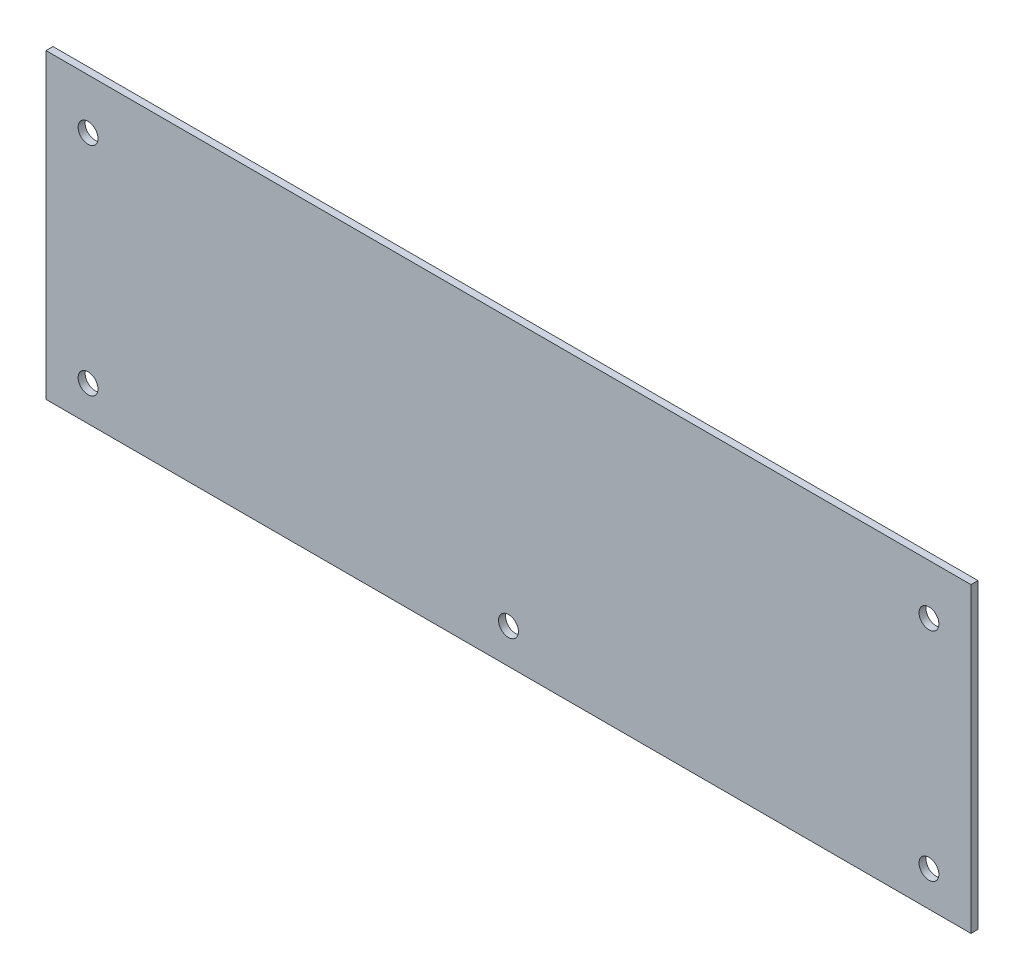
ISO-10303-21;
HEADER;
FILE_DESCRIPTION(('STEP AP214'),'2;1');
FILE_NAME('part.step','',(''),(''),'','','');
FILE_SCHEMA(('AUTOMOTIVE_DESIGN { 1 0 10303 214 1 1 1 1 }'));
ENDSEC;
DATA;
#1=APPLICATION_CONTEXT('core data for automotive mechanical design processes');
#2=APPLICATION_PROTOCOL_DEFINITION('international standard','automotive_design',2000,#1);
#3=PRODUCT_CONTEXT('',#1,'mechanical');
#4=PRODUCT('Part','Part','',(#3));
#5=PRODUCT_RELATED_PRODUCT_CATEGORY('part','',(#4));
#6=PRODUCT_DEFINITION_FORMATION('','',#4);
#7=PRODUCT_DEFINITION_CONTEXT('part definition',#1,'design');
#8=PRODUCT_DEFINITION('design','',#6,#7);
#9=PRODUCT_DEFINITION_SHAPE('','',#8);
#10=(LENGTH_UNIT() NAMED_UNIT(*) SI_UNIT(.MILLI.,.METRE.));
#11=(NAMED_UNIT(*) PLANE_ANGLE_UNIT() SI_UNIT($,.RADIAN.));
#12=(NAMED_UNIT(*) SI_UNIT($,.STERADIAN.) SOLID_ANGLE_UNIT());
#13=UNCERTAINTY_MEASURE_WITH_UNIT(LENGTH_MEASURE(1.E-05),#10,'distance_accuracy_value','');
#14=(GEOMETRIC_REPRESENTATION_CONTEXT(3) GLOBAL_UNCERTAINTY_ASSIGNED_CONTEXT((#13)) GLOBAL_UNIT_ASSIGNED_CONTEXT((#10,
#11,#12)) REPRESENTATION_CONTEXT('',''));
#15=CARTESIAN_POINT('',(0.,0.,0.));
#16=DIRECTION('',(0.,0.,1.));
#17=DIRECTION('',(1.,0.,0.));
#18=AXIS2_PLACEMENT_3D('',#15,#16,#17);
#19=CARTESIAN_POINT('',(0.,0.,3.));
#20=DIRECTION('',(0.,0.,-1.));
#21=DIRECTION('',(-1.,0.,0.));
#22=AXIS2_PLACEMENT_3D('',#19,#20,#21);
#23=PLANE('',#22);
#24=CARTESIAN_POINT('',(381.35,107.84,3.));
#25=DIRECTION('',(0.,0.,1.));
#26=DIRECTION('',(1.,0.,0.));
#27=AXIS2_PLACEMENT_3D('',#24,#25,#26);
#28=CIRCLE('',#27,4.25000000000001);
#29=CARTESIAN_POINT('',(385.6,107.84,3.));
#30=VERTEX_POINT('',#29);
#31=EDGE_CURVE('E130',#30,#30,#28,.T.);
#32=ORIENTED_EDGE('',*,*,#31,.F.);
#33=EDGE_LOOP('',(#32));
#34=FACE_BOUND('',#33,.T.);
#35=CARTESIAN_POINT('',(381.35,15.,3.));
#36=DIRECTION('',(0.,0.,1.));
#37=DIRECTION('',(1.,0.,0.));
#38=AXIS2_PLACEMENT_3D('',#35,#36,#37);
#39=CIRCLE('',#38,4.25000000000001);
#40=CARTESIAN_POINT('',(385.6,15.,3.));
#41=VERTEX_POINT('',#40);
#42=EDGE_CURVE('E138',#41,#41,#39,.T.);
#43=ORIENTED_EDGE('',*,*,#42,.F.);
#44=EDGE_LOOP('',(#43));
#45=FACE_BOUND('',#44,.T.);
#46=CARTESIAN_POINT('',(201.35,15.,3.));
#47=DIRECTION('',(0.,0.,1.));
#48=DIRECTION('',(1.,0.,0.));
#49=AXIS2_PLACEMENT_3D('',#46,#47,#48);
#50=CIRCLE('',#49,4.25);
#51=CARTESIAN_POINT('',(205.6,15.,3.));
#52=VERTEX_POINT('',#51);
#53=EDGE_CURVE('E146',#52,#52,#50,.T.);
#54=ORIENTED_EDGE('',*,*,#53,.F.);
#55=EDGE_LOOP('',(#54));
#56=FACE_BOUND('',#55,.T.);
#57=CARTESIAN_POINT('',(21.35,15.,3.));
#58=DIRECTION('',(0.,0.,1.));
#59=DIRECTION('',(1.,0.,0.));
#60=AXIS2_PLACEMENT_3D('',#57,#58,#59);
#61=CIRCLE('',#60,4.25);
#62=CARTESIAN_POINT('',(25.6,15.,3.));
#63=VERTEX_POINT('',#62);
#64=EDGE_CURVE('E154',#63,#63,#61,.T.);
#65=ORIENTED_EDGE('',*,*,#64,.F.);
#66=EDGE_LOOP('',(#65));
#67=FACE_BOUND('',#66,.T.);
#68=CARTESIAN_POINT('',(21.35,107.84,3.));
#69=DIRECTION('',(0.,0.,1.));
#70=DIRECTION('',(1.,0.,0.));
#71=AXIS2_PLACEMENT_3D('',#68,#69,#70);
#72=CIRCLE('',#71,4.25);
#73=CARTESIAN_POINT('',(25.6,107.84,3.));
#74=VERTEX_POINT('',#73);
#75=EDGE_CURVE('E122',#74,#74,#72,.T.);
#76=ORIENTED_EDGE('',*,*,#75,.F.);
#77=EDGE_LOOP('',(#76));
#78=FACE_BOUND('',#77,.T.);
#79=DIRECTION('',(-1.,0.,0.));
#80=VECTOR('',#79,1.);
#81=CARTESIAN_POINT('',(29.,129.34,3.));
#82=LINE('',#81,#80);
#83=CARTESIAN_POINT('',(399.35,129.34,3.));
#84=VERTEX_POINT('',#83);
#85=CARTESIAN_POINT('',(3.35000000000002,129.34,3.));
#86=VERTEX_POINT('',#85);
#87=EDGE_CURVE('E11',#84,#86,#82,.T.);
#88=ORIENTED_EDGE('',*,*,#87,.T.);
#89=DIRECTION('',(0.,1.,0.));
#90=VECTOR('',#89,1.);
#91=CARTESIAN_POINT('',(3.34999999999999,0.,3.));
#92=LINE('',#91,#90);
#93=CARTESIAN_POINT('',(3.34999999999999,0.,3.));
#94=VERTEX_POINT('',#93);
#95=EDGE_CURVE('E57',#94,#86,#92,.T.);
#96=ORIENTED_EDGE('',*,*,#95,.F.);
#97=DIRECTION('',(1.,0.,0.));
#98=VECTOR('',#97,1.);
#99=CARTESIAN_POINT('',(0.,0.,3.));
#100=LINE('',#99,#98);
#101=CARTESIAN_POINT('',(399.35,0.,3.));
#102=VERTEX_POINT('',#101);
#103=EDGE_CURVE('E49',#94,#102,#100,.T.);
#104=ORIENTED_EDGE('',*,*,#103,.T.);
#105=DIRECTION('',(0.,-1.,0.));
#106=VECTOR('',#105,1.);
#107=CARTESIAN_POINT('',(399.35,0.,3.));
#108=LINE('',#107,#106);
#109=EDGE_CURVE('E114',#84,#102,#108,.T.);
#110=ORIENTED_EDGE('',*,*,#109,.F.);
#111=EDGE_LOOP('',(#88,#96,#104,#110));
#112=FACE_BOUND('',#111,.T.);
#113=ADVANCED_FACE('F39',(#34,#45,#56,#67,#78,#112),#23,.F.);
#114=CARTESIAN_POINT('',(0.,0.,0.));
#115=DIRECTION('',(0.,0.,-1.));
#116=DIRECTION('',(-1.,0.,0.));
#117=AXIS2_PLACEMENT_3D('',#114,#115,#116);
#118=PLANE('',#117);
#119=CARTESIAN_POINT('',(381.35,107.84,0.));
#120=DIRECTION('',(0.,0.,1.));
#121=DIRECTION('',(1.,0.,0.));
#122=AXIS2_PLACEMENT_3D('',#119,#120,#121);
#123=CIRCLE('',#122,4.25000000000001);
#124=CARTESIAN_POINT('',(385.6,107.84,0.));
#125=VERTEX_POINT('',#124);
#126=EDGE_CURVE('E134',#125,#125,#123,.T.);
#127=ORIENTED_EDGE('',*,*,#126,.T.);
#128=EDGE_LOOP('',(#127));
#129=FACE_BOUND('',#128,.T.);
#130=CARTESIAN_POINT('',(381.35,15.,0.));
#131=DIRECTION('',(0.,0.,1.));
#132=DIRECTION('',(1.,0.,0.));
#133=AXIS2_PLACEMENT_3D('',#130,#131,#132);
#134=CIRCLE('',#133,4.25000000000001);
#135=CARTESIAN_POINT('',(385.6,15.,0.));
#136=VERTEX_POINT('',#135);
#137=EDGE_CURVE('E142',#136,#136,#134,.T.);
#138=ORIENTED_EDGE('',*,*,#137,.T.);
#139=EDGE_LOOP('',(#138));
#140=FACE_BOUND('',#139,.T.);
#141=CARTESIAN_POINT('',(201.35,15.,0.));
#142=DIRECTION('',(0.,0.,1.));
#143=DIRECTION('',(1.,0.,0.));
#144=AXIS2_PLACEMENT_3D('',#141,#142,#143);
#145=CIRCLE('',#144,4.25);
#146=CARTESIAN_POINT('',(205.6,15.,0.));
#147=VERTEX_POINT('',#146);
#148=EDGE_CURVE('E150',#147,#147,#145,.T.);
#149=ORIENTED_EDGE('',*,*,#148,.T.);
#150=EDGE_LOOP('',(#149));
#151=FACE_BOUND('',#150,.T.);
#152=CARTESIAN_POINT('',(21.35,15.,0.));
#153=DIRECTION('',(0.,0.,1.));
#154=DIRECTION('',(1.,0.,0.));
#155=AXIS2_PLACEMENT_3D('',#152,#153,#154);
#156=CIRCLE('',#155,4.25);
#157=CARTESIAN_POINT('',(25.6,15.,0.));
#158=VERTEX_POINT('',#157);
#159=EDGE_CURVE('E126',#158,#158,#156,.T.);
#160=ORIENTED_EDGE('',*,*,#159,.T.);
#161=EDGE_LOOP('',(#160));
#162=FACE_BOUND('',#161,.T.);
#163=CARTESIAN_POINT('',(21.35,107.84,0.));
#164=DIRECTION('',(0.,0.,1.));
#165=DIRECTION('',(1.,0.,0.));
#166=AXIS2_PLACEMENT_3D('',#163,#164,#165);
#167=CIRCLE('',#166,4.25);
#168=CARTESIAN_POINT('',(25.6,107.84,0.));
#169=VERTEX_POINT('',#168);
#170=EDGE_CURVE('E117',#169,#169,#167,.T.);
#171=ORIENTED_EDGE('',*,*,#170,.T.);
#172=EDGE_LOOP('',(#171));
#173=FACE_BOUND('',#172,.T.);
#174=DIRECTION('',(0.,1.,0.));
#175=VECTOR('',#174,1.);
#176=CARTESIAN_POINT('',(3.34999999999999,0.,0.));
#177=LINE('',#176,#175);
#178=CARTESIAN_POINT('',(3.34999999999999,0.,0.));
#179=VERTEX_POINT('',#178);
#180=CARTESIAN_POINT('',(3.35000000000002,129.34,0.));
#181=VERTEX_POINT('',#180);
#182=EDGE_CURVE('E81',#179,#181,#177,.T.);
#183=ORIENTED_EDGE('',*,*,#182,.T.);
#184=DIRECTION('',(-1.,0.,0.));
#185=VECTOR('',#184,1.);
#186=CARTESIAN_POINT('',(29.,129.34,0.));
#187=LINE('',#186,#185);
#188=CARTESIAN_POINT('',(399.35,129.34,0.));
#189=VERTEX_POINT('',#188);
#190=EDGE_CURVE('E43',#189,#181,#187,.T.);
#191=ORIENTED_EDGE('',*,*,#190,.F.);
#192=DIRECTION('',(0.,-1.,0.));
#193=VECTOR('',#192,1.);
#194=CARTESIAN_POINT('',(399.35,0.,0.));
#195=LINE('',#194,#193);
#196=CARTESIAN_POINT('',(399.35,0.,0.));
#197=VERTEX_POINT('',#196);
#198=EDGE_CURVE('E65',#189,#197,#195,.T.);
#199=ORIENTED_EDGE('',*,*,#198,.T.);
#200=DIRECTION('',(1.,0.,0.));
#201=VECTOR('',#200,1.);
#202=CARTESIAN_POINT('',(0.,0.,0.));
#203=LINE('',#202,#201);
#204=EDGE_CURVE('E96',#179,#197,#203,.T.);
#205=ORIENTED_EDGE('',*,*,#204,.F.);
#206=EDGE_LOOP('',(#183,#191,#199,#205));
#207=FACE_BOUND('',#206,.T.);
#208=ADVANCED_FACE('F100',(#129,#140,#151,#162,#173,#207),#118,.T.);
#209=CARTESIAN_POINT('',(0.,0.,3.));
#210=DIRECTION('',(0.,1.,0.));
#211=DIRECTION('',(0.,0.,1.));
#212=AXIS2_PLACEMENT_3D('',#209,#210,#211);
#213=PLANE('',#212);
#214=ORIENTED_EDGE('',*,*,#103,.F.);
#215=DIRECTION('',(0.,0.,1.));
#216=VECTOR('',#215,1.);
#217=CARTESIAN_POINT('',(3.34999999999999,0.,0.));
#218=LINE('',#217,#216);
#219=EDGE_CURVE('E84',#179,#94,#218,.T.);
#220=ORIENTED_EDGE('',*,*,#219,.F.);
#221=ORIENTED_EDGE('',*,*,#204,.T.);
#222=DIRECTION('',(0.,0.,1.));
#223=VECTOR('',#222,1.);
#224=CARTESIAN_POINT('',(399.35,0.,0.));
#225=LINE('',#224,#223);
#226=EDGE_CURVE('E111',#197,#102,#225,.T.);
#227=ORIENTED_EDGE('',*,*,#226,.T.);
#228=EDGE_LOOP('',(#214,#220,#221,#227));
#229=FACE_BOUND('',#228,.T.);
#230=ADVANCED_FACE('F41',(#229),#213,.F.);
#231=CARTESIAN_POINT('',(29.,129.34,3.));
#232=DIRECTION('',(0.,-1.,0.));
#233=DIRECTION('',(0.,0.,-1.));
#234=AXIS2_PLACEMENT_3D('',#231,#232,#233);
#235=PLANE('',#234);
#236=ORIENTED_EDGE('',*,*,#190,.T.);
#237=DIRECTION('',(0.,0.,1.));
#238=VECTOR('',#237,1.);
#239=CARTESIAN_POINT('',(3.35000000000002,129.34,0.));
#240=LINE('',#239,#238);
#241=EDGE_CURVE('E85',#181,#86,#240,.T.);
#242=ORIENTED_EDGE('',*,*,#241,.T.);
#243=ORIENTED_EDGE('',*,*,#87,.F.);
#244=DIRECTION('',(0.,0.,1.));
#245=VECTOR('',#244,1.);
#246=CARTESIAN_POINT('',(399.35,129.34,0.));
#247=LINE('',#246,#245);
#248=EDGE_CURVE('E108',#189,#84,#247,.T.);
#249=ORIENTED_EDGE('',*,*,#248,.F.);
#250=EDGE_LOOP('',(#236,#242,#243,#249));
#251=FACE_BOUND('',#250,.T.);
#252=ADVANCED_FACE('F181',(#251),#235,.F.);
#253=CARTESIAN_POINT('',(399.35,0.,0.));
#254=DIRECTION('',(-1.,0.,0.));
#255=DIRECTION('',(0.,0.,1.));
#256=AXIS2_PLACEMENT_3D('',#253,#254,#255);
#257=PLANE('',#256);
#258=ORIENTED_EDGE('',*,*,#109,.T.);
#259=ORIENTED_EDGE('',*,*,#226,.F.);
#260=ORIENTED_EDGE('',*,*,#198,.F.);
#261=ORIENTED_EDGE('',*,*,#248,.T.);
#262=EDGE_LOOP('',(#258,#259,#260,#261));
#263=FACE_BOUND('',#262,.T.);
#264=ADVANCED_FACE('F182',(#263),#257,.F.);
#265=CARTESIAN_POINT('',(3.34999999999999,0.,0.));
#266=DIRECTION('',(1.,0.,0.));
#267=DIRECTION('',(0.,1.,0.));
#268=AXIS2_PLACEMENT_3D('',#265,#266,#267);
#269=PLANE('',#268);
#270=ORIENTED_EDGE('',*,*,#95,.T.);
#271=ORIENTED_EDGE('',*,*,#241,.F.);
#272=ORIENTED_EDGE('',*,*,#182,.F.);
#273=ORIENTED_EDGE('',*,*,#219,.T.);
#274=EDGE_LOOP('',(#270,#271,#272,#273));
#275=FACE_BOUND('',#274,.T.);
#276=ADVANCED_FACE('F83',(#275),#269,.F.);
#277=CARTESIAN_POINT('',(21.35,107.84,0.));
#278=DIRECTION('',(0.,0.,1.));
#279=DIRECTION('',(1.,0.,0.));
#280=AXIS2_PLACEMENT_3D('',#277,#278,#279);
#281=CYLINDRICAL_SURFACE('',#280,4.25);
#282=ORIENTED_EDGE('',*,*,#170,.F.);
#283=EDGE_LOOP('',(#282));
#284=FACE_BOUND('',#283,.T.);
#285=ORIENTED_EDGE('',*,*,#75,.T.);
#286=EDGE_LOOP('',(#285));
#287=FACE_BOUND('',#286,.T.);
#288=ADVANCED_FACE('F168',(#284,#287),#281,.F.);
#289=CARTESIAN_POINT('',(21.35,15.,0.));
#290=DIRECTION('',(0.,0.,1.));
#291=DIRECTION('',(1.,0.,0.));
#292=AXIS2_PLACEMENT_3D('',#289,#290,#291);
#293=CYLINDRICAL_SURFACE('',#292,4.25);
#294=ORIENTED_EDGE('',*,*,#159,.F.);
#295=EDGE_LOOP('',(#294));
#296=FACE_BOUND('',#295,.T.);
#297=ORIENTED_EDGE('',*,*,#64,.T.);
#298=EDGE_LOOP('',(#297));
#299=FACE_BOUND('',#298,.T.);
#300=ADVANCED_FACE('F164',(#296,#299),#293,.F.);
#301=CARTESIAN_POINT('',(201.35,15.,0.));
#302=DIRECTION('',(0.,0.,1.));
#303=DIRECTION('',(1.,0.,0.));
#304=AXIS2_PLACEMENT_3D('',#301,#302,#303);
#305=CYLINDRICAL_SURFACE('',#304,4.25);
#306=ORIENTED_EDGE('',*,*,#148,.F.);
#307=EDGE_LOOP('',(#306));
#308=FACE_BOUND('',#307,.T.);
#309=ORIENTED_EDGE('',*,*,#53,.T.);
#310=EDGE_LOOP('',(#309));
#311=FACE_BOUND('',#310,.T.);
#312=ADVANCED_FACE('F167',(#308,#311),#305,.F.);
#313=CARTESIAN_POINT('',(381.35,15.,0.));
#314=DIRECTION('',(0.,0.,1.));
#315=DIRECTION('',(1.,0.,0.));
#316=AXIS2_PLACEMENT_3D('',#313,#314,#315);
#317=CYLINDRICAL_SURFACE('',#316,4.25000000000001);
#318=ORIENTED_EDGE('',*,*,#137,.F.);
#319=EDGE_LOOP('',(#318));
#320=FACE_BOUND('',#319,.T.);
#321=ORIENTED_EDGE('',*,*,#42,.T.);
#322=EDGE_LOOP('',(#321));
#323=FACE_BOUND('',#322,.T.);
#324=ADVANCED_FACE('F205',(#320,#323),#317,.F.);
#325=CARTESIAN_POINT('',(381.35,107.84,0.));
#326=DIRECTION('',(0.,0.,1.));
#327=DIRECTION('',(1.,0.,0.));
#328=AXIS2_PLACEMENT_3D('',#325,#326,#327);
#329=CYLINDRICAL_SURFACE('',#328,4.25000000000001);
#330=ORIENTED_EDGE('',*,*,#126,.F.);
#331=EDGE_LOOP('',(#330));
#332=FACE_BOUND('',#331,.T.);
#333=ORIENTED_EDGE('',*,*,#31,.T.);
#334=EDGE_LOOP('',(#333));
#335=FACE_BOUND('',#334,.T.);
#336=ADVANCED_FACE('F212',(#332,#335),#329,.F.);
#337=CLOSED_SHELL('',(#113,#208,#230,#252,#264,#276,#288,#300,#312,#324,#336));
#338=MANIFOLD_SOLID_BREP('B2',#337);
#339=ADVANCED_BREP_SHAPE_REPRESENTATION('',(#18,#338),#14);
#340=SHAPE_DEFINITION_REPRESENTATION(#9,#339);
ENDSEC;
END-ISO-10303-21;
